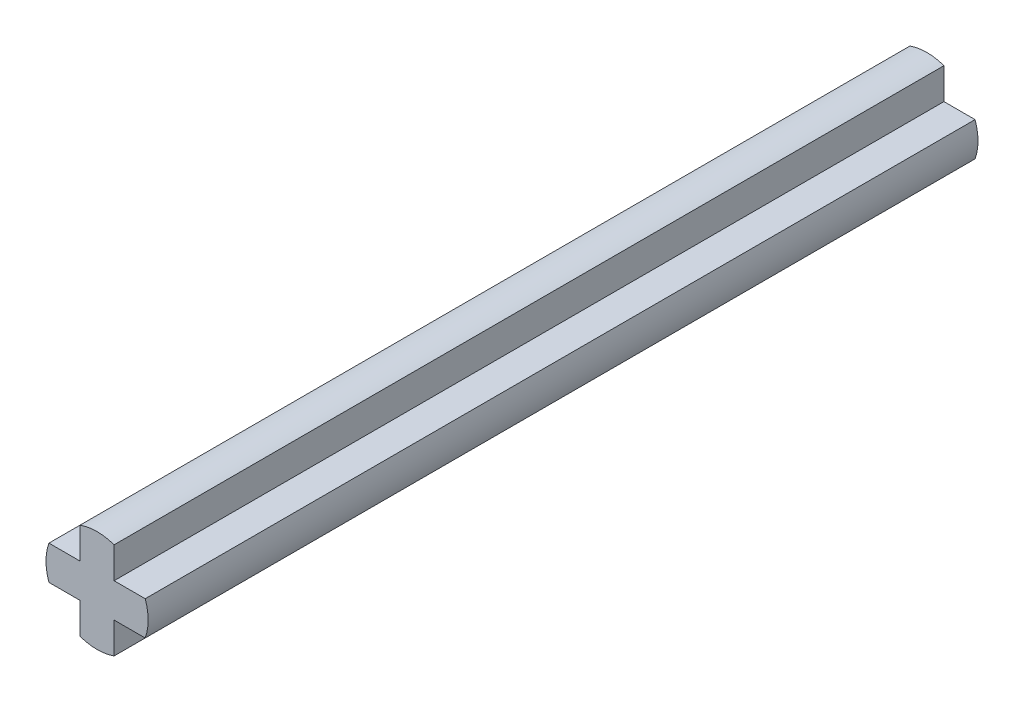
ISO-10303-21;
HEADER;
FILE_DESCRIPTION(('STEP AP214'),'2;1');
FILE_NAME('part.step','',(''),(''),'','','');
FILE_SCHEMA(('AUTOMOTIVE_DESIGN { 1 0 10303 214 1 1 1 1 }'));
ENDSEC;
DATA;
#1=APPLICATION_CONTEXT('core data for automotive mechanical design processes');
#2=APPLICATION_PROTOCOL_DEFINITION('international standard','automotive_design',2000,#1);
#3=PRODUCT_CONTEXT('',#1,'mechanical');
#4=PRODUCT('Part','Part','',(#3));
#5=PRODUCT_RELATED_PRODUCT_CATEGORY('part','',(#4));
#6=PRODUCT_DEFINITION_FORMATION('','',#4);
#7=PRODUCT_DEFINITION_CONTEXT('part definition',#1,'design');
#8=PRODUCT_DEFINITION('design','',#6,#7);
#9=PRODUCT_DEFINITION_SHAPE('','',#8);
#10=(LENGTH_UNIT() NAMED_UNIT(*) SI_UNIT(.MILLI.,.METRE.));
#11=(NAMED_UNIT(*) PLANE_ANGLE_UNIT() SI_UNIT($,.RADIAN.));
#12=(NAMED_UNIT(*) SI_UNIT($,.STERADIAN.) SOLID_ANGLE_UNIT());
#13=UNCERTAINTY_MEASURE_WITH_UNIT(LENGTH_MEASURE(1.E-05),#10,'distance_accuracy_value','');
#14=(GEOMETRIC_REPRESENTATION_CONTEXT(3) GLOBAL_UNCERTAINTY_ASSIGNED_CONTEXT((#13)) GLOBAL_UNIT_ASSIGNED_CONTEXT((#10,
#11,#12)) REPRESENTATION_CONTEXT('',''));
#15=CARTESIAN_POINT('',(0.,0.,0.));
#16=DIRECTION('',(0.,0.,1.));
#17=DIRECTION('',(1.,0.,0.));
#18=AXIS2_PLACEMENT_3D('',#15,#16,#17);
#19=CARTESIAN_POINT('',(-2.26274169979695,0.8,39.));
#20=DIRECTION('',(0.,-1.,0.));
#21=DIRECTION('',(1.,0.,0.));
#22=AXIS2_PLACEMENT_3D('',#19,#20,#21);
#23=PLANE('',#22);
#24=DIRECTION('',(-1.,0.,0.));
#25=VECTOR('',#24,1.);
#26=CARTESIAN_POINT('',(-2.26274169979695,0.8,0.));
#27=LINE('',#26,#25);
#28=CARTESIAN_POINT('',(-0.8,0.8,0.));
#29=VERTEX_POINT('',#28);
#30=CARTESIAN_POINT('',(-2.26274169979695,0.8,0.));
#31=VERTEX_POINT('',#30);
#32=EDGE_CURVE('E153',#29,#31,#27,.T.);
#33=ORIENTED_EDGE('',*,*,#32,.T.);
#34=DIRECTION('',(0.,0.,-1.));
#35=VECTOR('',#34,1.);
#36=CARTESIAN_POINT('',(-2.26274169979695,0.8,39.));
#37=LINE('',#36,#35);
#38=CARTESIAN_POINT('',(-2.26274169979695,0.8,39.));
#39=VERTEX_POINT('',#38);
#40=EDGE_CURVE('E11',#39,#31,#37,.T.);
#41=ORIENTED_EDGE('',*,*,#40,.F.);
#42=DIRECTION('',(-1.,0.,0.));
#43=VECTOR('',#42,1.);
#44=CARTESIAN_POINT('',(-2.26274169979695,0.8,39.));
#45=LINE('',#44,#43);
#46=CARTESIAN_POINT('',(-0.8,0.8,39.));
#47=VERTEX_POINT('',#46);
#48=EDGE_CURVE('E175',#47,#39,#45,.T.);
#49=ORIENTED_EDGE('',*,*,#48,.F.);
#50=DIRECTION('',(0.,0.,-1.));
#51=VECTOR('',#50,1.);
#52=CARTESIAN_POINT('',(-0.8,0.8,39.));
#53=LINE('',#52,#51);
#54=EDGE_CURVE('E149',#47,#29,#53,.T.);
#55=ORIENTED_EDGE('',*,*,#54,.T.);
#56=EDGE_LOOP('',(#33,#41,#49,#55));
#57=FACE_BOUND('',#56,.T.);
#58=ADVANCED_FACE('F33',(#57),#23,.F.);
#59=CARTESIAN_POINT('',(0.,0.,39.));
#60=DIRECTION('',(0.,0.,-1.));
#61=DIRECTION('',(-1.,0.,0.));
#62=AXIS2_PLACEMENT_3D('',#59,#60,#61);
#63=CYLINDRICAL_SURFACE('',#62,2.4);
#64=CARTESIAN_POINT('',(0.,0.,0.));
#65=DIRECTION('',(0.,0.,1.));
#66=DIRECTION('',(1.,0.,0.));
#67=AXIS2_PLACEMENT_3D('',#64,#65,#66);
#68=CIRCLE('',#67,2.4);
#69=CARTESIAN_POINT('',(-2.26274169979695,-0.8,0.));
#70=VERTEX_POINT('',#69);
#71=EDGE_CURVE('E156',#31,#70,#68,.T.);
#72=ORIENTED_EDGE('',*,*,#71,.T.);
#73=DIRECTION('',(0.,0.,-1.));
#74=VECTOR('',#73,1.);
#75=CARTESIAN_POINT('',(-2.26274169979695,-0.8,39.));
#76=LINE('',#75,#74);
#77=CARTESIAN_POINT('',(-2.26274169979695,-0.8,39.));
#78=VERTEX_POINT('',#77);
#79=EDGE_CURVE('E41',#78,#70,#76,.T.);
#80=ORIENTED_EDGE('',*,*,#79,.F.);
#81=CARTESIAN_POINT('',(0.,0.,39.));
#82=DIRECTION('',(0.,0.,1.));
#83=DIRECTION('',(1.,0.,0.));
#84=AXIS2_PLACEMENT_3D('',#81,#82,#83);
#85=CIRCLE('',#84,2.4);
#86=EDGE_CURVE('E104',#39,#78,#85,.T.);
#87=ORIENTED_EDGE('',*,*,#86,.F.);
#88=ORIENTED_EDGE('',*,*,#40,.T.);
#89=EDGE_LOOP('',(#72,#80,#87,#88));
#90=FACE_BOUND('',#89,.T.);
#91=ADVANCED_FACE('F253',(#90),#63,.T.);
#92=CARTESIAN_POINT('',(-2.26274169979695,-0.8,39.));
#93=DIRECTION('',(0.,1.,0.));
#94=DIRECTION('',(-1.,0.,0.));
#95=AXIS2_PLACEMENT_3D('',#92,#93,#94);
#96=PLANE('',#95);
#97=DIRECTION('',(1.,0.,0.));
#98=VECTOR('',#97,1.);
#99=CARTESIAN_POINT('',(-2.26274169979695,-0.8,0.));
#100=LINE('',#99,#98);
#101=CARTESIAN_POINT('',(-0.8,-0.8,0.));
#102=VERTEX_POINT('',#101);
#103=EDGE_CURVE('E158',#70,#102,#100,.T.);
#104=ORIENTED_EDGE('',*,*,#103,.T.);
#105=DIRECTION('',(0.,0.,-1.));
#106=VECTOR('',#105,1.);
#107=CARTESIAN_POINT('',(-0.8,-0.8,39.));
#108=LINE('',#107,#106);
#109=CARTESIAN_POINT('',(-0.8,-0.8,39.));
#110=VERTEX_POINT('',#109);
#111=EDGE_CURVE('E194',#110,#102,#108,.T.);
#112=ORIENTED_EDGE('',*,*,#111,.F.);
#113=DIRECTION('',(1.,0.,0.));
#114=VECTOR('',#113,1.);
#115=CARTESIAN_POINT('',(-2.26274169979695,-0.8,39.));
#116=LINE('',#115,#114);
#117=EDGE_CURVE('E202',#78,#110,#116,.T.);
#118=ORIENTED_EDGE('',*,*,#117,.F.);
#119=ORIENTED_EDGE('',*,*,#79,.T.);
#120=EDGE_LOOP('',(#104,#112,#118,#119));
#121=FACE_BOUND('',#120,.T.);
#122=ADVANCED_FACE('F200',(#121),#96,.F.);
#123=CARTESIAN_POINT('',(-0.8,-0.8,39.));
#124=DIRECTION('',(1.,0.,0.));
#125=DIRECTION('',(0.,1.,0.));
#126=AXIS2_PLACEMENT_3D('',#123,#124,#125);
#127=PLANE('',#126);
#128=DIRECTION('',(0.,-1.,0.));
#129=VECTOR('',#128,1.);
#130=CARTESIAN_POINT('',(-0.8,-0.8,0.));
#131=LINE('',#130,#129);
#132=CARTESIAN_POINT('',(-0.8,-2.26274169979695,0.));
#133=VERTEX_POINT('',#132);
#134=EDGE_CURVE('E160',#102,#133,#131,.T.);
#135=ORIENTED_EDGE('',*,*,#134,.T.);
#136=DIRECTION('',(0.,0.,-1.));
#137=VECTOR('',#136,1.);
#138=CARTESIAN_POINT('',(-0.8,-2.26274169979695,39.));
#139=LINE('',#138,#137);
#140=CARTESIAN_POINT('',(-0.8,-2.26274169979695,39.));
#141=VERTEX_POINT('',#140);
#142=EDGE_CURVE('E191',#141,#133,#139,.T.);
#143=ORIENTED_EDGE('',*,*,#142,.F.);
#144=DIRECTION('',(0.,-1.,0.));
#145=VECTOR('',#144,1.);
#146=CARTESIAN_POINT('',(-0.8,-0.8,39.));
#147=LINE('',#146,#145);
#148=EDGE_CURVE('E220',#110,#141,#147,.T.);
#149=ORIENTED_EDGE('',*,*,#148,.F.);
#150=ORIENTED_EDGE('',*,*,#111,.T.);
#151=EDGE_LOOP('',(#135,#143,#149,#150));
#152=FACE_BOUND('',#151,.T.);
#153=ADVANCED_FACE('F211',(#152),#127,.F.);
#154=CARTESIAN_POINT('',(0.,0.,39.));
#155=DIRECTION('',(0.,0.,-1.));
#156=DIRECTION('',(-1.,0.,0.));
#157=AXIS2_PLACEMENT_3D('',#154,#155,#156);
#158=CYLINDRICAL_SURFACE('',#157,2.4);
#159=CARTESIAN_POINT('',(0.,0.,0.));
#160=DIRECTION('',(0.,0.,1.));
#161=DIRECTION('',(1.,0.,0.));
#162=AXIS2_PLACEMENT_3D('',#159,#160,#161);
#163=CIRCLE('',#162,2.4);
#164=CARTESIAN_POINT('',(0.8,-2.26274169979695,0.));
#165=VERTEX_POINT('',#164);
#166=EDGE_CURVE('E162',#133,#165,#163,.T.);
#167=ORIENTED_EDGE('',*,*,#166,.T.);
#168=DIRECTION('',(0.,0.,-1.));
#169=VECTOR('',#168,1.);
#170=CARTESIAN_POINT('',(0.8,-2.26274169979695,39.));
#171=LINE('',#170,#169);
#172=CARTESIAN_POINT('',(0.8,-2.26274169979695,39.));
#173=VERTEX_POINT('',#172);
#174=EDGE_CURVE('E188',#173,#165,#171,.T.);
#175=ORIENTED_EDGE('',*,*,#174,.F.);
#176=CARTESIAN_POINT('',(0.,0.,39.));
#177=DIRECTION('',(0.,0.,1.));
#178=DIRECTION('',(1.,0.,0.));
#179=AXIS2_PLACEMENT_3D('',#176,#177,#178);
#180=CIRCLE('',#179,2.4);
#181=EDGE_CURVE('E217',#141,#173,#180,.T.);
#182=ORIENTED_EDGE('',*,*,#181,.F.);
#183=ORIENTED_EDGE('',*,*,#142,.T.);
#184=EDGE_LOOP('',(#167,#175,#182,#183));
#185=FACE_BOUND('',#184,.T.);
#186=ADVANCED_FACE('F215',(#185),#158,.T.);
#187=CARTESIAN_POINT('',(0.8,-0.8,39.));
#188=DIRECTION('',(-1.,0.,0.));
#189=DIRECTION('',(0.,-1.,0.));
#190=AXIS2_PLACEMENT_3D('',#187,#188,#189);
#191=PLANE('',#190);
#192=DIRECTION('',(0.,1.,0.));
#193=VECTOR('',#192,1.);
#194=CARTESIAN_POINT('',(0.8,-0.8,0.));
#195=LINE('',#194,#193);
#196=CARTESIAN_POINT('',(0.8,-0.8,0.));
#197=VERTEX_POINT('',#196);
#198=EDGE_CURVE('E164',#165,#197,#195,.T.);
#199=ORIENTED_EDGE('',*,*,#198,.T.);
#200=DIRECTION('',(0.,0.,-1.));
#201=VECTOR('',#200,1.);
#202=CARTESIAN_POINT('',(0.8,-0.8,39.));
#203=LINE('',#202,#201);
#204=CARTESIAN_POINT('',(0.8,-0.8,39.));
#205=VERTEX_POINT('',#204);
#206=EDGE_CURVE('E185',#205,#197,#203,.T.);
#207=ORIENTED_EDGE('',*,*,#206,.F.);
#208=DIRECTION('',(0.,1.,0.));
#209=VECTOR('',#208,1.);
#210=CARTESIAN_POINT('',(0.8,-0.8,39.));
#211=LINE('',#210,#209);
#212=EDGE_CURVE('E219',#173,#205,#211,.T.);
#213=ORIENTED_EDGE('',*,*,#212,.F.);
#214=ORIENTED_EDGE('',*,*,#174,.T.);
#215=EDGE_LOOP('',(#199,#207,#213,#214));
#216=FACE_BOUND('',#215,.T.);
#217=ADVANCED_FACE('F266',(#216),#191,.F.);
#218=CARTESIAN_POINT('',(0.8,-0.8,39.));
#219=DIRECTION('',(0.,1.,0.));
#220=DIRECTION('',(-1.,0.,0.));
#221=AXIS2_PLACEMENT_3D('',#218,#219,#220);
#222=PLANE('',#221);
#223=DIRECTION('',(1.,0.,0.));
#224=VECTOR('',#223,1.);
#225=CARTESIAN_POINT('',(0.8,-0.8,0.));
#226=LINE('',#225,#224);
#227=CARTESIAN_POINT('',(2.26274169979695,-0.8,0.));
#228=VERTEX_POINT('',#227);
#229=EDGE_CURVE('E166',#197,#228,#226,.T.);
#230=ORIENTED_EDGE('',*,*,#229,.T.);
#231=DIRECTION('',(0.,0.,-1.));
#232=VECTOR('',#231,1.);
#233=CARTESIAN_POINT('',(2.26274169979695,-0.8,39.));
#234=LINE('',#233,#232);
#235=CARTESIAN_POINT('',(2.26274169979695,-0.8,39.));
#236=VERTEX_POINT('',#235);
#237=EDGE_CURVE('E182',#236,#228,#234,.T.);
#238=ORIENTED_EDGE('',*,*,#237,.F.);
#239=DIRECTION('',(1.,0.,0.));
#240=VECTOR('',#239,1.);
#241=CARTESIAN_POINT('',(0.8,-0.8,39.));
#242=LINE('',#241,#240);
#243=EDGE_CURVE('E222',#205,#236,#242,.T.);
#244=ORIENTED_EDGE('',*,*,#243,.F.);
#245=ORIENTED_EDGE('',*,*,#206,.T.);
#246=EDGE_LOOP('',(#230,#238,#244,#245));
#247=FACE_BOUND('',#246,.T.);
#248=ADVANCED_FACE('F269',(#247),#222,.F.);
#249=CARTESIAN_POINT('',(0.,0.,39.));
#250=DIRECTION('',(0.,0.,-1.));
#251=DIRECTION('',(-1.,0.,0.));
#252=AXIS2_PLACEMENT_3D('',#249,#250,#251);
#253=CYLINDRICAL_SURFACE('',#252,2.4);
#254=CARTESIAN_POINT('',(0.,0.,0.));
#255=DIRECTION('',(0.,0.,1.));
#256=DIRECTION('',(1.,0.,0.));
#257=AXIS2_PLACEMENT_3D('',#254,#255,#256);
#258=CIRCLE('',#257,2.4);
#259=CARTESIAN_POINT('',(2.26274169979695,0.8,0.));
#260=VERTEX_POINT('',#259);
#261=EDGE_CURVE('E168',#228,#260,#258,.T.);
#262=ORIENTED_EDGE('',*,*,#261,.T.);
#263=DIRECTION('',(0.,0.,-1.));
#264=VECTOR('',#263,1.);
#265=CARTESIAN_POINT('',(2.26274169979695,0.8,39.));
#266=LINE('',#265,#264);
#267=CARTESIAN_POINT('',(2.26274169979695,0.8,39.));
#268=VERTEX_POINT('',#267);
#269=EDGE_CURVE('E179',#268,#260,#266,.T.);
#270=ORIENTED_EDGE('',*,*,#269,.F.);
#271=CARTESIAN_POINT('',(0.,0.,39.));
#272=DIRECTION('',(0.,0.,1.));
#273=DIRECTION('',(1.,0.,0.));
#274=AXIS2_PLACEMENT_3D('',#271,#272,#273);
#275=CIRCLE('',#274,2.4);
#276=EDGE_CURVE('E228',#236,#268,#275,.T.);
#277=ORIENTED_EDGE('',*,*,#276,.F.);
#278=ORIENTED_EDGE('',*,*,#237,.T.);
#279=EDGE_LOOP('',(#262,#270,#277,#278));
#280=FACE_BOUND('',#279,.T.);
#281=ADVANCED_FACE('F234',(#280),#253,.T.);
#282=CARTESIAN_POINT('',(0.8,0.8,39.));
#283=DIRECTION('',(0.,-1.,0.));
#284=DIRECTION('',(1.,0.,0.));
#285=AXIS2_PLACEMENT_3D('',#282,#283,#284);
#286=PLANE('',#285);
#287=DIRECTION('',(-1.,0.,0.));
#288=VECTOR('',#287,1.);
#289=CARTESIAN_POINT('',(0.8,0.8,0.));
#290=LINE('',#289,#288);
#291=CARTESIAN_POINT('',(0.8,0.8,0.));
#292=VERTEX_POINT('',#291);
#293=EDGE_CURVE('E170',#260,#292,#290,.T.);
#294=ORIENTED_EDGE('',*,*,#293,.T.);
#295=DIRECTION('',(0.,0.,-1.));
#296=VECTOR('',#295,1.);
#297=CARTESIAN_POINT('',(0.8,0.8,39.));
#298=LINE('',#297,#296);
#299=CARTESIAN_POINT('',(0.8,0.8,39.));
#300=VERTEX_POINT('',#299);
#301=EDGE_CURVE('E144',#300,#292,#298,.T.);
#302=ORIENTED_EDGE('',*,*,#301,.F.);
#303=DIRECTION('',(-1.,0.,0.));
#304=VECTOR('',#303,1.);
#305=CARTESIAN_POINT('',(0.8,0.8,39.));
#306=LINE('',#305,#304);
#307=EDGE_CURVE('E135',#268,#300,#306,.T.);
#308=ORIENTED_EDGE('',*,*,#307,.F.);
#309=ORIENTED_EDGE('',*,*,#269,.T.);
#310=EDGE_LOOP('',(#294,#302,#308,#309));
#311=FACE_BOUND('',#310,.T.);
#312=ADVANCED_FACE('F238',(#311),#286,.F.);
#313=CARTESIAN_POINT('',(0.8,2.26274169979695,39.));
#314=DIRECTION('',(-1.,0.,0.));
#315=DIRECTION('',(0.,-1.,0.));
#316=AXIS2_PLACEMENT_3D('',#313,#314,#315);
#317=PLANE('',#316);
#318=DIRECTION('',(0.,1.,0.));
#319=VECTOR('',#318,1.);
#320=CARTESIAN_POINT('',(0.8,2.26274169979695,0.));
#321=LINE('',#320,#319);
#322=CARTESIAN_POINT('',(0.8,2.26274169979695,0.));
#323=VERTEX_POINT('',#322);
#324=EDGE_CURVE('E143',#292,#323,#321,.T.);
#325=ORIENTED_EDGE('',*,*,#324,.T.);
#326=DIRECTION('',(0.,0.,-1.));
#327=VECTOR('',#326,1.);
#328=CARTESIAN_POINT('',(0.8,2.26274169979695,39.));
#329=LINE('',#328,#327);
#330=CARTESIAN_POINT('',(0.8,2.26274169979695,39.));
#331=VERTEX_POINT('',#330);
#332=EDGE_CURVE('E140',#331,#323,#329,.T.);
#333=ORIENTED_EDGE('',*,*,#332,.F.);
#334=DIRECTION('',(0.,1.,0.));
#335=VECTOR('',#334,1.);
#336=CARTESIAN_POINT('',(0.8,2.26274169979695,39.));
#337=LINE('',#336,#335);
#338=EDGE_CURVE('E129',#300,#331,#337,.T.);
#339=ORIENTED_EDGE('',*,*,#338,.F.);
#340=ORIENTED_EDGE('',*,*,#301,.T.);
#341=EDGE_LOOP('',(#325,#333,#339,#340));
#342=FACE_BOUND('',#341,.T.);
#343=ADVANCED_FACE('F141',(#342),#317,.F.);
#344=CARTESIAN_POINT('',(0.,0.,39.));
#345=DIRECTION('',(0.,0.,-1.));
#346=DIRECTION('',(-1.,0.,0.));
#347=AXIS2_PLACEMENT_3D('',#344,#345,#346);
#348=CYLINDRICAL_SURFACE('',#347,2.4);
#349=CARTESIAN_POINT('',(0.,0.,0.));
#350=DIRECTION('',(0.,0.,1.));
#351=DIRECTION('',(1.,0.,0.));
#352=AXIS2_PLACEMENT_3D('',#349,#350,#351);
#353=CIRCLE('',#352,2.4);
#354=CARTESIAN_POINT('',(-0.8,2.26274169979695,0.));
#355=VERTEX_POINT('',#354);
#356=EDGE_CURVE('E90',#323,#355,#353,.T.);
#357=ORIENTED_EDGE('',*,*,#356,.T.);
#358=DIRECTION('',(0.,0.,-1.));
#359=VECTOR('',#358,1.);
#360=CARTESIAN_POINT('',(-0.8,2.26274169979695,39.));
#361=LINE('',#360,#359);
#362=CARTESIAN_POINT('',(-0.8,2.26274169979695,39.));
#363=VERTEX_POINT('',#362);
#364=EDGE_CURVE('E145',#363,#355,#361,.T.);
#365=ORIENTED_EDGE('',*,*,#364,.F.);
#366=CARTESIAN_POINT('',(0.,0.,39.));
#367=DIRECTION('',(0.,0.,1.));
#368=DIRECTION('',(1.,0.,0.));
#369=AXIS2_PLACEMENT_3D('',#366,#367,#368);
#370=CIRCLE('',#369,2.4);
#371=EDGE_CURVE('E133',#331,#363,#370,.T.);
#372=ORIENTED_EDGE('',*,*,#371,.F.);
#373=ORIENTED_EDGE('',*,*,#332,.T.);
#374=EDGE_LOOP('',(#357,#365,#372,#373));
#375=FACE_BOUND('',#374,.T.);
#376=ADVANCED_FACE('F147',(#375),#348,.T.);
#377=CARTESIAN_POINT('',(-0.8,2.26274169979695,39.));
#378=DIRECTION('',(1.,0.,0.));
#379=DIRECTION('',(0.,1.,0.));
#380=AXIS2_PLACEMENT_3D('',#377,#378,#379);
#381=PLANE('',#380);
#382=DIRECTION('',(0.,-1.,0.));
#383=VECTOR('',#382,1.);
#384=CARTESIAN_POINT('',(-0.8,2.26274169979695,0.));
#385=LINE('',#384,#383);
#386=EDGE_CURVE('E96',#355,#29,#385,.T.);
#387=ORIENTED_EDGE('',*,*,#386,.T.);
#388=ORIENTED_EDGE('',*,*,#54,.F.);
#389=DIRECTION('',(0.,-1.,0.));
#390=VECTOR('',#389,1.);
#391=CARTESIAN_POINT('',(-0.8,2.26274169979695,39.));
#392=LINE('',#391,#390);
#393=EDGE_CURVE('E49',#363,#47,#392,.T.);
#394=ORIENTED_EDGE('',*,*,#393,.F.);
#395=ORIENTED_EDGE('',*,*,#364,.T.);
#396=EDGE_LOOP('',(#387,#388,#394,#395));
#397=FACE_BOUND('',#396,.T.);
#398=ADVANCED_FACE('F242',(#397),#381,.F.);
#399=CARTESIAN_POINT('',(0.,0.,39.));
#400=DIRECTION('',(0.,0.,1.));
#401=DIRECTION('',(1.,0.,0.));
#402=AXIS2_PLACEMENT_3D('',#399,#400,#401);
#403=PLANE('',#402);
#404=ORIENTED_EDGE('',*,*,#48,.T.);
#405=ORIENTED_EDGE('',*,*,#86,.T.);
#406=ORIENTED_EDGE('',*,*,#117,.T.);
#407=ORIENTED_EDGE('',*,*,#148,.T.);
#408=ORIENTED_EDGE('',*,*,#181,.T.);
#409=ORIENTED_EDGE('',*,*,#212,.T.);
#410=ORIENTED_EDGE('',*,*,#243,.T.);
#411=ORIENTED_EDGE('',*,*,#276,.T.);
#412=ORIENTED_EDGE('',*,*,#307,.T.);
#413=ORIENTED_EDGE('',*,*,#338,.T.);
#414=ORIENTED_EDGE('',*,*,#371,.T.);
#415=ORIENTED_EDGE('',*,*,#393,.T.);
#416=EDGE_LOOP('',(#404,#405,#406,#407,#408,#409,#410,#411,#412,#413,#414,#415));
#417=FACE_BOUND('',#416,.T.);
#418=ADVANCED_FACE('F131',(#417),#403,.T.);
#419=CARTESIAN_POINT('',(0.,0.,0.));
#420=DIRECTION('',(0.,0.,1.));
#421=DIRECTION('',(1.,0.,0.));
#422=AXIS2_PLACEMENT_3D('',#419,#420,#421);
#423=PLANE('',#422);
#424=ORIENTED_EDGE('',*,*,#32,.F.);
#425=ORIENTED_EDGE('',*,*,#386,.F.);
#426=ORIENTED_EDGE('',*,*,#356,.F.);
#427=ORIENTED_EDGE('',*,*,#324,.F.);
#428=ORIENTED_EDGE('',*,*,#293,.F.);
#429=ORIENTED_EDGE('',*,*,#261,.F.);
#430=ORIENTED_EDGE('',*,*,#229,.F.);
#431=ORIENTED_EDGE('',*,*,#198,.F.);
#432=ORIENTED_EDGE('',*,*,#166,.F.);
#433=ORIENTED_EDGE('',*,*,#134,.F.);
#434=ORIENTED_EDGE('',*,*,#103,.F.);
#435=ORIENTED_EDGE('',*,*,#71,.F.);
#436=EDGE_LOOP('',(#424,#425,#426,#427,#428,#429,#430,#431,#432,#433,#434,#435));
#437=FACE_BOUND('',#436,.T.);
#438=ADVANCED_FACE('F206',(#437),#423,.F.);
#439=CLOSED_SHELL('',(#58,#91,#122,#153,#186,#217,#248,#281,#312,#343,#376,#398,#418,#438));
#440=MANIFOLD_SOLID_BREP('B2',#439);
#441=ADVANCED_BREP_SHAPE_REPRESENTATION('',(#18,#440),#14);
#442=SHAPE_DEFINITION_REPRESENTATION(#9,#441);
ENDSEC;
END-ISO-10303-21;
